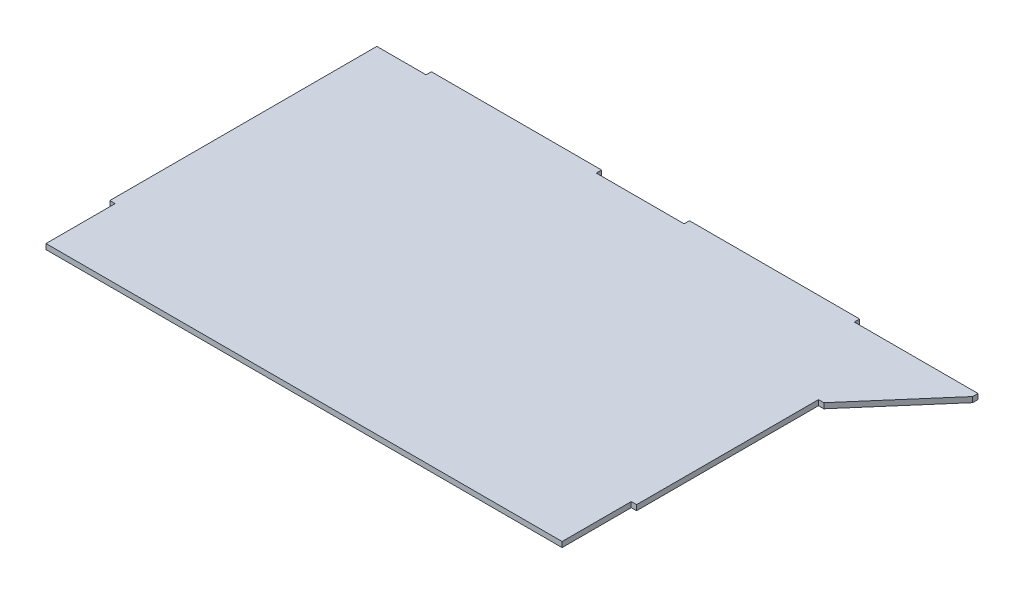
ISO-10303-21;
HEADER;
FILE_DESCRIPTION(('STEP AP214'),'2;1');
FILE_NAME('part.step','',(''),(''),'','','');
FILE_SCHEMA(('AUTOMOTIVE_DESIGN { 1 0 10303 214 1 1 1 1 }'));
ENDSEC;
DATA;
#1=APPLICATION_CONTEXT('core data for automotive mechanical design processes');
#2=APPLICATION_PROTOCOL_DEFINITION('international standard','automotive_design',2000,#1);
#3=PRODUCT_CONTEXT('',#1,'mechanical');
#4=PRODUCT('Part','Part','',(#3));
#5=PRODUCT_RELATED_PRODUCT_CATEGORY('part','',(#4));
#6=PRODUCT_DEFINITION_FORMATION('','',#4);
#7=PRODUCT_DEFINITION_CONTEXT('part definition',#1,'design');
#8=PRODUCT_DEFINITION('design','',#6,#7);
#9=PRODUCT_DEFINITION_SHAPE('','',#8);
#10=(LENGTH_UNIT() NAMED_UNIT(*) SI_UNIT(.MILLI.,.METRE.));
#11=(NAMED_UNIT(*) PLANE_ANGLE_UNIT() SI_UNIT($,.RADIAN.));
#12=(NAMED_UNIT(*) SI_UNIT($,.STERADIAN.) SOLID_ANGLE_UNIT());
#13=UNCERTAINTY_MEASURE_WITH_UNIT(LENGTH_MEASURE(1.E-05),#10,'distance_accuracy_value','');
#14=(GEOMETRIC_REPRESENTATION_CONTEXT(3) GLOBAL_UNCERTAINTY_ASSIGNED_CONTEXT((#13)) GLOBAL_UNIT_ASSIGNED_CONTEXT((#10,
#11,#12)) REPRESENTATION_CONTEXT('',''));
#15=CARTESIAN_POINT('',(0.,0.,0.));
#16=DIRECTION('',(0.,0.,1.));
#17=DIRECTION('',(1.,0.,0.));
#18=AXIS2_PLACEMENT_3D('',#15,#16,#17);
#19=CARTESIAN_POINT('',(0.,0.,0.));
#20=DIRECTION('',(0.,0.,-1.));
#21=DIRECTION('',(-1.,0.,0.));
#22=AXIS2_PLACEMENT_3D('',#19,#20,#21);
#23=PLANE('',#22);
#24=DIRECTION('',(0.,1.,0.));
#25=VECTOR('',#24,1.);
#26=CARTESIAN_POINT('',(-26.2205000100001,1.5875,0.));
#27=LINE('',#26,#25);
#28=CARTESIAN_POINT('',(-26.2205000100001,-1.5875,0.));
#29=VERTEX_POINT('',#28);
#30=CARTESIAN_POINT('',(-26.2205000100001,1.5875,0.));
#31=VERTEX_POINT('',#30);
#32=EDGE_CURVE('E56',#29,#31,#27,.T.);
#33=ORIENTED_EDGE('',*,*,#32,.T.);
#34=DIRECTION('',(-1.,0.,0.));
#35=VECTOR('',#34,1.);
#36=CARTESIAN_POINT('',(-157.21584,1.5875,0.));
#37=LINE('',#36,#35);
#38=CARTESIAN_POINT('',(26.2205000100001,1.5875,0.));
#39=VERTEX_POINT('',#38);
#40=EDGE_CURVE('E300',#39,#31,#37,.T.);
#41=ORIENTED_EDGE('',*,*,#40,.F.);
#42=DIRECTION('',(0.,1.,0.));
#43=VECTOR('',#42,1.);
#44=CARTESIAN_POINT('',(26.2205000100001,1.5875,0.));
#45=LINE('',#44,#43);
#46=CARTESIAN_POINT('',(26.2205000100001,-1.5875,0.));
#47=VERTEX_POINT('',#46);
#48=EDGE_CURVE('E176',#47,#39,#45,.T.);
#49=ORIENTED_EDGE('',*,*,#48,.F.);
#50=DIRECTION('',(1.,0.,0.));
#51=VECTOR('',#50,1.);
#52=CARTESIAN_POINT('',(-157.21584,-1.5875,0.));
#53=LINE('',#52,#51);
#54=EDGE_CURVE('E63',#29,#47,#53,.T.);
#55=ORIENTED_EDGE('',*,*,#54,.F.);
#56=EDGE_LOOP('',(#33,#41,#49,#55));
#57=FACE_BOUND('',#56,.T.);
#58=ADVANCED_FACE('F41',(#57),#23,.T.);
#59=DIRECTION('',(0.,-1.,0.));
#60=VECTOR('',#59,1.);
#61=CARTESIAN_POINT('',(-127.82050001,1.5875,0.));
#62=LINE('',#61,#60);
#63=CARTESIAN_POINT('',(-127.82050001,1.5875,0.));
#64=VERTEX_POINT('',#63);
#65=CARTESIAN_POINT('',(-127.82050001,-1.5875,0.));
#66=VERTEX_POINT('',#65);
#67=EDGE_CURVE('E187',#64,#66,#62,.T.);
#68=ORIENTED_EDGE('',*,*,#67,.T.);
#69=CARTESIAN_POINT('',(-157.21584,-1.5875,0.));
#70=VERTEX_POINT('',#69);
#71=EDGE_CURVE('E292',#70,#66,#53,.T.);
#72=ORIENTED_EDGE('',*,*,#71,.F.);
#73=DIRECTION('',(0.,-1.,0.));
#74=VECTOR('',#73,1.);
#75=CARTESIAN_POINT('',(-157.21584,-1.5875,0.));
#76=LINE('',#75,#74);
#77=CARTESIAN_POINT('',(-157.21584,1.5875,0.));
#78=VERTEX_POINT('',#77);
#79=EDGE_CURVE('E299',#78,#70,#76,.T.);
#80=ORIENTED_EDGE('',*,*,#79,.F.);
#81=EDGE_CURVE('E288',#64,#78,#37,.T.);
#82=ORIENTED_EDGE('',*,*,#81,.F.);
#83=EDGE_LOOP('',(#68,#72,#80,#82));
#84=FACE_BOUND('',#83,.T.);
#85=ADVANCED_FACE('F378',(#84),#23,.T.);
#86=CARTESIAN_POINT('',(157.21584,-1.5875,200.66180012));
#87=DIRECTION('',(-1.,0.,0.));
#88=DIRECTION('',(0.,0.,1.));
#89=AXIS2_PLACEMENT_3D('',#86,#87,#88);
#90=PLANE('',#89);
#91=DIRECTION('',(0.,-1.,0.));
#92=VECTOR('',#91,1.);
#93=CARTESIAN_POINT('',(157.21584,1.5875,50.8));
#94=LINE('',#93,#92);
#95=CARTESIAN_POINT('',(157.21584,1.5875,50.8000000000001));
#96=VERTEX_POINT('',#95);
#97=CARTESIAN_POINT('',(157.21584,-1.5875,50.8));
#98=VERTEX_POINT('',#97);
#99=EDGE_CURVE('E250',#96,#98,#94,.T.);
#100=ORIENTED_EDGE('',*,*,#99,.F.);
#101=DIRECTION('',(0.,0.,-1.));
#102=VECTOR('',#101,1.);
#103=CARTESIAN_POINT('',(157.21584,1.5875,200.66180012));
#104=LINE('',#103,#102);
#105=CARTESIAN_POINT('',(157.21584,1.5875,159.38680012));
#106=VERTEX_POINT('',#105);
#107=EDGE_CURVE('E311',#106,#96,#104,.T.);
#108=ORIENTED_EDGE('',*,*,#107,.F.);
#109=DIRECTION('',(0.,1.,0.));
#110=VECTOR('',#109,1.);
#111=CARTESIAN_POINT('',(157.21584,-1.5875,159.38680012));
#112=LINE('',#111,#110);
#113=CARTESIAN_POINT('',(157.21584,-1.5875,159.38680012));
#114=VERTEX_POINT('',#113);
#115=EDGE_CURVE('E11',#114,#106,#112,.T.);
#116=ORIENTED_EDGE('',*,*,#115,.F.);
#117=DIRECTION('',(0.,0.,-1.));
#118=VECTOR('',#117,1.);
#119=CARTESIAN_POINT('',(157.21584,-1.5875,200.66180012));
#120=LINE('',#119,#118);
#121=EDGE_CURVE('E295',#114,#98,#120,.T.);
#122=ORIENTED_EDGE('',*,*,#121,.T.);
#123=EDGE_LOOP('',(#100,#108,#116,#122));
#124=FACE_BOUND('',#123,.T.);
#125=ADVANCED_FACE('F43',(#124),#90,.F.);
#126=CARTESIAN_POINT('',(-157.21584,1.5875,200.66180012));
#127=DIRECTION('',(0.,-1.,0.));
#128=DIRECTION('',(0.,0.,-1.));
#129=AXIS2_PLACEMENT_3D('',#126,#127,#128);
#130=PLANE('',#129);
#131=DIRECTION('',(-1.,0.,0.));
#132=VECTOR('',#131,1.);
#133=CARTESIAN_POINT('',(-157.21584,1.5875,159.38680012));
#134=LINE('',#133,#132);
#135=CARTESIAN_POINT('',(154.04084,1.5875,159.38680012));
#136=VERTEX_POINT('',#135);
#137=EDGE_CURVE('E268',#106,#136,#134,.T.);
#138=ORIENTED_EDGE('',*,*,#137,.F.);
#139=ORIENTED_EDGE('',*,*,#107,.T.);
#140=DIRECTION('',(-1.,0.,0.));
#141=VECTOR('',#140,1.);
#142=CARTESIAN_POINT('',(157.21584,1.5875,50.8));
#143=LINE('',#142,#141);
#144=CARTESIAN_POINT('',(160.39084,1.5875,50.8));
#145=VERTEX_POINT('',#144);
#146=EDGE_CURVE('E239',#145,#96,#143,.T.);
#147=ORIENTED_EDGE('',*,*,#146,.F.);
#148=DIRECTION('',(-0.654792410139879,0.,0.755808771861778));
#149=VECTOR('',#148,1.);
#150=CARTESIAN_POINT('',(160.39084,1.5875,50.8));
#151=LINE('',#150,#149);
#152=CARTESIAN_POINT('',(201.6506,1.5875,3.175));
#153=VERTEX_POINT('',#152);
#154=EDGE_CURVE('E235',#153,#145,#151,.T.);
#155=ORIENTED_EDGE('',*,*,#154,.F.);
#156=DIRECTION('',(0.,0.,1.));
#157=VECTOR('',#156,1.);
#158=CARTESIAN_POINT('',(201.6506,1.5875,0.));
#159=LINE('',#158,#157);
#160=CARTESIAN_POINT('',(201.6506,1.5875,0.));
#161=VERTEX_POINT('',#160);
#162=EDGE_CURVE('E232',#161,#153,#159,.T.);
#163=ORIENTED_EDGE('',*,*,#162,.F.);
#164=CARTESIAN_POINT('',(127.82050001,1.5875,0.));
#165=VERTEX_POINT('',#164);
#166=EDGE_CURVE('E296',#161,#165,#37,.T.);
#167=ORIENTED_EDGE('',*,*,#166,.T.);
#168=DIRECTION('',(0.,0.,1.));
#169=VECTOR('',#168,1.);
#170=CARTESIAN_POINT('',(127.82050001,1.5875,-3.175));
#171=LINE('',#170,#169);
#172=CARTESIAN_POINT('',(127.82050001,1.5875,-3.175));
#173=VERTEX_POINT('',#172);
#174=EDGE_CURVE('E225',#173,#165,#171,.T.);
#175=ORIENTED_EDGE('',*,*,#174,.F.);
#176=DIRECTION('',(1.,0.,0.));
#177=VECTOR('',#176,1.);
#178=CARTESIAN_POINT('',(127.82050001,1.5875,-3.175));
#179=LINE('',#178,#177);
#180=CARTESIAN_POINT('',(26.2205000100001,1.5875,-3.175));
#181=VERTEX_POINT('',#180);
#182=EDGE_CURVE('E208',#181,#173,#179,.T.);
#183=ORIENTED_EDGE('',*,*,#182,.F.);
#184=DIRECTION('',(0.,0.,1.));
#185=VECTOR('',#184,1.);
#186=CARTESIAN_POINT('',(26.2205000100001,1.5875,-3.175));
#187=LINE('',#186,#185);
#188=EDGE_CURVE('E228',#181,#39,#187,.T.);
#189=ORIENTED_EDGE('',*,*,#188,.T.);
#190=ORIENTED_EDGE('',*,*,#40,.T.);
#191=DIRECTION('',(0.,0.,1.));
#192=VECTOR('',#191,1.);
#193=CARTESIAN_POINT('',(-26.2205000100001,1.5875,-3.175));
#194=LINE('',#193,#192);
#195=CARTESIAN_POINT('',(-26.2205000100001,1.5875,-3.175));
#196=VERTEX_POINT('',#195);
#197=EDGE_CURVE('E197',#196,#31,#194,.T.);
#198=ORIENTED_EDGE('',*,*,#197,.F.);
#199=DIRECTION('',(-1.,0.,0.));
#200=VECTOR('',#199,1.);
#201=CARTESIAN_POINT('',(-127.82050001,1.5875,-3.175));
#202=LINE('',#201,#200);
#203=CARTESIAN_POINT('',(-127.82050001,1.5875,-3.175));
#204=VERTEX_POINT('',#203);
#205=EDGE_CURVE('E186',#196,#204,#202,.T.);
#206=ORIENTED_EDGE('',*,*,#205,.T.);
#207=DIRECTION('',(0.,0.,1.));
#208=VECTOR('',#207,1.);
#209=CARTESIAN_POINT('',(-127.82050001,1.5875,-3.175));
#210=LINE('',#209,#208);
#211=EDGE_CURVE('E202',#204,#64,#210,.T.);
#212=ORIENTED_EDGE('',*,*,#211,.T.);
#213=ORIENTED_EDGE('',*,*,#81,.T.);
#214=DIRECTION('',(0.,0.,-1.));
#215=VECTOR('',#214,1.);
#216=CARTESIAN_POINT('',(-157.21584,1.5875,200.66180012));
#217=LINE('',#216,#215);
#218=CARTESIAN_POINT('',(-157.21584,1.5875,159.38680012));
#219=VERTEX_POINT('',#218);
#220=EDGE_CURVE('E308',#219,#78,#217,.T.);
#221=ORIENTED_EDGE('',*,*,#220,.F.);
#222=DIRECTION('',(1.,0.,0.));
#223=VECTOR('',#222,1.);
#224=CARTESIAN_POINT('',(-157.21584,1.5875,159.38680012));
#225=LINE('',#224,#223);
#226=CARTESIAN_POINT('',(-154.04084,1.5875,159.38680012));
#227=VERTEX_POINT('',#226);
#228=EDGE_CURVE('E285',#219,#227,#225,.T.);
#229=ORIENTED_EDGE('',*,*,#228,.T.);
#230=DIRECTION('',(0.,0.,-1.));
#231=VECTOR('',#230,1.);
#232=CARTESIAN_POINT('',(-154.04084,1.5875,200.66180012));
#233=LINE('',#232,#231);
#234=CARTESIAN_POINT('',(-154.04084,1.5875,200.66180012));
#235=VERTEX_POINT('',#234);
#236=EDGE_CURVE('E283',#235,#227,#233,.T.);
#237=ORIENTED_EDGE('',*,*,#236,.F.);
#238=DIRECTION('',(-1.,0.,0.));
#239=VECTOR('',#238,1.);
#240=CARTESIAN_POINT('',(-157.21584,1.5875,200.66180012));
#241=LINE('',#240,#239);
#242=CARTESIAN_POINT('',(154.04084,1.5875,200.66180012));
#243=VERTEX_POINT('',#242);
#244=EDGE_CURVE('E289',#243,#235,#241,.T.);
#245=ORIENTED_EDGE('',*,*,#244,.F.);
#246=DIRECTION('',(0.,0.,-1.));
#247=VECTOR('',#246,1.);
#248=CARTESIAN_POINT('',(154.04084,1.5875,200.66180012));
#249=LINE('',#248,#247);
#250=EDGE_CURVE('E270',#243,#136,#249,.T.);
#251=ORIENTED_EDGE('',*,*,#250,.T.);
#252=EDGE_LOOP('',(#138,#139,#147,#155,#163,#167,#175,#183,#189,#190,#198,#206,#212,#213,#221,
#229,#237,#245,#251));
#253=FACE_BOUND('',#252,.T.);
#254=ADVANCED_FACE('F324',(#253),#130,.F.);
#255=CARTESIAN_POINT('',(-157.21584,-1.5875,200.66180012));
#256=DIRECTION('',(0.,1.,0.));
#257=DIRECTION('',(0.,0.,1.));
#258=AXIS2_PLACEMENT_3D('',#255,#256,#257);
#259=PLANE('',#258);
#260=DIRECTION('',(-1.,0.,0.));
#261=VECTOR('',#260,1.);
#262=CARTESIAN_POINT('',(0.,-1.5875,159.38680012));
#263=LINE('',#262,#261);
#264=CARTESIAN_POINT('',(154.04084,-1.5875,159.38680012));
#265=VERTEX_POINT('',#264);
#266=EDGE_CURVE('E253',#114,#265,#263,.T.);
#267=ORIENTED_EDGE('',*,*,#266,.T.);
#268=DIRECTION('',(0.,0.,-1.));
#269=VECTOR('',#268,1.);
#270=CARTESIAN_POINT('',(154.04084,-1.5875,0.));
#271=LINE('',#270,#269);
#272=CARTESIAN_POINT('',(154.04084,-1.5875,200.66180012));
#273=VERTEX_POINT('',#272);
#274=EDGE_CURVE('E261',#273,#265,#271,.T.);
#275=ORIENTED_EDGE('',*,*,#274,.F.);
#276=DIRECTION('',(1.,0.,0.));
#277=VECTOR('',#276,1.);
#278=CARTESIAN_POINT('',(-157.21584,-1.5875,200.66180012));
#279=LINE('',#278,#277);
#280=CARTESIAN_POINT('',(-154.04084,-1.5875,200.66180012));
#281=VERTEX_POINT('',#280);
#282=EDGE_CURVE('E291',#281,#273,#279,.T.);
#283=ORIENTED_EDGE('',*,*,#282,.F.);
#284=DIRECTION('',(0.,0.,-1.));
#285=VECTOR('',#284,1.);
#286=CARTESIAN_POINT('',(-154.04084,-1.5875,0.));
#287=LINE('',#286,#285);
#288=CARTESIAN_POINT('',(-154.04084,-1.5875,159.38680012));
#289=VERTEX_POINT('',#288);
#290=EDGE_CURVE('E273',#281,#289,#287,.T.);
#291=ORIENTED_EDGE('',*,*,#290,.T.);
#292=DIRECTION('',(1.,0.,0.));
#293=VECTOR('',#292,1.);
#294=CARTESIAN_POINT('',(0.,-1.5875,159.38680012));
#295=LINE('',#294,#293);
#296=CARTESIAN_POINT('',(-157.21584,-1.5875,159.38680012));
#297=VERTEX_POINT('',#296);
#298=EDGE_CURVE('E276',#297,#289,#295,.T.);
#299=ORIENTED_EDGE('',*,*,#298,.F.);
#300=DIRECTION('',(0.,0.,-1.));
#301=VECTOR('',#300,1.);
#302=CARTESIAN_POINT('',(-157.21584,-1.5875,200.66180012));
#303=LINE('',#302,#301);
#304=EDGE_CURVE('E306',#297,#70,#303,.T.);
#305=ORIENTED_EDGE('',*,*,#304,.T.);
#306=ORIENTED_EDGE('',*,*,#71,.T.);
#307=DIRECTION('',(0.,0.,1.));
#308=VECTOR('',#307,1.);
#309=CARTESIAN_POINT('',(-127.82050001,-1.5875,-3.175));
#310=LINE('',#309,#308);
#311=CARTESIAN_POINT('',(-127.82050001,-1.5875,-3.175));
#312=VERTEX_POINT('',#311);
#313=EDGE_CURVE('E177',#312,#66,#310,.T.);
#314=ORIENTED_EDGE('',*,*,#313,.F.);
#315=DIRECTION('',(1.,0.,0.));
#316=VECTOR('',#315,1.);
#317=CARTESIAN_POINT('',(-127.82050001,-1.5875,-3.175));
#318=LINE('',#317,#316);
#319=CARTESIAN_POINT('',(-26.2205000100001,-1.5875,-3.175));
#320=VERTEX_POINT('',#319);
#321=EDGE_CURVE('E183',#312,#320,#318,.T.);
#322=ORIENTED_EDGE('',*,*,#321,.T.);
#323=DIRECTION('',(0.,0.,1.));
#324=VECTOR('',#323,1.);
#325=CARTESIAN_POINT('',(-26.2205000100001,-1.5875,-3.175));
#326=LINE('',#325,#324);
#327=EDGE_CURVE('E170',#320,#29,#326,.T.);
#328=ORIENTED_EDGE('',*,*,#327,.T.);
#329=ORIENTED_EDGE('',*,*,#54,.T.);
#330=DIRECTION('',(0.,0.,1.));
#331=VECTOR('',#330,1.);
#332=CARTESIAN_POINT('',(26.2205000100001,-1.5875,-3.175));
#333=LINE('',#332,#331);
#334=CARTESIAN_POINT('',(26.2205000100001,-1.5875,-3.175));
#335=VERTEX_POINT('',#334);
#336=EDGE_CURVE('E215',#335,#47,#333,.T.);
#337=ORIENTED_EDGE('',*,*,#336,.F.);
#338=DIRECTION('',(-1.,0.,0.));
#339=VECTOR('',#338,1.);
#340=CARTESIAN_POINT('',(127.82050001,-1.5875,-3.175));
#341=LINE('',#340,#339);
#342=CARTESIAN_POINT('',(127.82050001,-1.5875,-3.175));
#343=VERTEX_POINT('',#342);
#344=EDGE_CURVE('E213',#343,#335,#341,.T.);
#345=ORIENTED_EDGE('',*,*,#344,.F.);
#346=DIRECTION('',(0.,0.,1.));
#347=VECTOR('',#346,1.);
#348=CARTESIAN_POINT('',(127.82050001,-1.5875,-3.175));
#349=LINE('',#348,#347);
#350=CARTESIAN_POINT('',(127.82050001,-1.5875,0.));
#351=VERTEX_POINT('',#350);
#352=EDGE_CURVE('E222',#343,#351,#349,.T.);
#353=ORIENTED_EDGE('',*,*,#352,.T.);
#354=CARTESIAN_POINT('',(201.6506,-1.5875,0.));
#355=VERTEX_POINT('',#354);
#356=EDGE_CURVE('E303',#351,#355,#53,.T.);
#357=ORIENTED_EDGE('',*,*,#356,.T.);
#358=DIRECTION('',(0.,0.,1.));
#359=VECTOR('',#358,1.);
#360=CARTESIAN_POINT('',(201.6506,-1.5875,0.));
#361=LINE('',#360,#359);
#362=CARTESIAN_POINT('',(201.6506,-1.5875,3.175));
#363=VERTEX_POINT('',#362);
#364=EDGE_CURVE('E231',#355,#363,#361,.T.);
#365=ORIENTED_EDGE('',*,*,#364,.T.);
#366=DIRECTION('',(-0.654792410139879,0.,0.755808771861778));
#367=VECTOR('',#366,1.);
#368=CARTESIAN_POINT('',(160.39084,-1.5875,50.8));
#369=LINE('',#368,#367);
#370=CARTESIAN_POINT('',(160.39084,-1.5875,50.8));
#371=VERTEX_POINT('',#370);
#372=EDGE_CURVE('E245',#363,#371,#369,.T.);
#373=ORIENTED_EDGE('',*,*,#372,.T.);
#374=DIRECTION('',(-1.,0.,0.));
#375=VECTOR('',#374,1.);
#376=CARTESIAN_POINT('',(157.21584,-1.5875,50.8));
#377=LINE('',#376,#375);
#378=EDGE_CURVE('E236',#371,#98,#377,.T.);
#379=ORIENTED_EDGE('',*,*,#378,.T.);
#380=ORIENTED_EDGE('',*,*,#121,.F.);
#381=EDGE_LOOP('',(#267,#275,#283,#291,#299,#305,#306,#314,#322,#328,#329,#337,#345,#353,#357,
#365,#373,#379,#380));
#382=FACE_BOUND('',#381,.T.);
#383=ADVANCED_FACE('F190',(#382),#259,.F.);
#384=CARTESIAN_POINT('',(0.,0.,200.66180012));
#385=DIRECTION('',(0.,0.,-1.));
#386=DIRECTION('',(-1.,0.,0.));
#387=AXIS2_PLACEMENT_3D('',#384,#385,#386);
#388=PLANE('',#387);
#389=ORIENTED_EDGE('',*,*,#282,.T.);
#390=DIRECTION('',(0.,-1.,0.));
#391=VECTOR('',#390,1.);
#392=CARTESIAN_POINT('',(154.04084,1.587512,200.66180012));
#393=LINE('',#392,#391);
#394=EDGE_CURVE('E264',#243,#273,#393,.T.);
#395=ORIENTED_EDGE('',*,*,#394,.F.);
#396=ORIENTED_EDGE('',*,*,#244,.T.);
#397=DIRECTION('',(0.,1.,0.));
#398=VECTOR('',#397,1.);
#399=CARTESIAN_POINT('',(-154.04084,0.,200.66180012));
#400=LINE('',#399,#398);
#401=EDGE_CURVE('E49',#281,#235,#400,.T.);
#402=ORIENTED_EDGE('',*,*,#401,.F.);
#403=EDGE_LOOP('',(#389,#395,#396,#402));
#404=FACE_BOUND('',#403,.T.);
#405=ADVANCED_FACE('F337',(#404),#388,.F.);
#406=CARTESIAN_POINT('',(-157.21584,-1.5875,200.66180012));
#407=DIRECTION('',(1.,0.,0.));
#408=DIRECTION('',(0.,0.,-1.));
#409=AXIS2_PLACEMENT_3D('',#406,#407,#408);
#410=PLANE('',#409);
#411=ORIENTED_EDGE('',*,*,#304,.F.);
#412=DIRECTION('',(0.,-1.,0.));
#413=VECTOR('',#412,1.);
#414=CARTESIAN_POINT('',(-157.21584,1.587512,159.38680012));
#415=LINE('',#414,#413);
#416=EDGE_CURVE('E279',#219,#297,#415,.T.);
#417=ORIENTED_EDGE('',*,*,#416,.F.);
#418=ORIENTED_EDGE('',*,*,#220,.T.);
#419=ORIENTED_EDGE('',*,*,#79,.T.);
#420=EDGE_LOOP('',(#411,#417,#418,#419));
#421=FACE_BOUND('',#420,.T.);
#422=ADVANCED_FACE('F332',(#421),#410,.F.);
#423=DIRECTION('',(0.,-1.,0.));
#424=VECTOR('',#423,1.);
#425=CARTESIAN_POINT('',(127.82050001,1.5875,0.));
#426=LINE('',#425,#424);
#427=EDGE_CURVE('E209',#165,#351,#426,.T.);
#428=ORIENTED_EDGE('',*,*,#427,.F.);
#429=ORIENTED_EDGE('',*,*,#166,.F.);
#430=DIRECTION('',(0.,-1.,0.));
#431=VECTOR('',#430,1.);
#432=CARTESIAN_POINT('',(201.6506,1.5875,0.));
#433=LINE('',#432,#431);
#434=EDGE_CURVE('E242',#161,#355,#433,.T.);
#435=ORIENTED_EDGE('',*,*,#434,.T.);
#436=ORIENTED_EDGE('',*,*,#356,.F.);
#437=EDGE_LOOP('',(#428,#429,#435,#436));
#438=FACE_BOUND('',#437,.T.);
#439=ADVANCED_FACE('F360',(#438),#23,.T.);
#440=CARTESIAN_POINT('',(0.,1.587512,159.38680012));
#441=DIRECTION('',(0.,0.,-1.));
#442=DIRECTION('',(-1.,0.,0.));
#443=AXIS2_PLACEMENT_3D('',#440,#441,#442);
#444=PLANE('',#443);
#445=ORIENTED_EDGE('',*,*,#416,.T.);
#446=ORIENTED_EDGE('',*,*,#298,.T.);
#447=DIRECTION('',(0.,-1.,0.));
#448=VECTOR('',#447,1.);
#449=CARTESIAN_POINT('',(-154.04084,1.587512,159.38680012));
#450=LINE('',#449,#448);
#451=EDGE_CURVE('E281',#227,#289,#450,.T.);
#452=ORIENTED_EDGE('',*,*,#451,.F.);
#453=ORIENTED_EDGE('',*,*,#228,.F.);
#454=EDGE_LOOP('',(#445,#446,#452,#453));
#455=FACE_BOUND('',#454,.T.);
#456=ADVANCED_FACE('F328',(#455),#444,.F.);
#457=CARTESIAN_POINT('',(-154.04084,1.587512,0.));
#458=DIRECTION('',(-1.,0.,0.));
#459=DIRECTION('',(0.,0.,1.));
#460=AXIS2_PLACEMENT_3D('',#457,#458,#459);
#461=PLANE('',#460);
#462=ORIENTED_EDGE('',*,*,#236,.T.);
#463=ORIENTED_EDGE('',*,*,#451,.T.);
#464=ORIENTED_EDGE('',*,*,#290,.F.);
#465=ORIENTED_EDGE('',*,*,#401,.T.);
#466=EDGE_LOOP('',(#462,#463,#464,#465));
#467=FACE_BOUND('',#466,.T.);
#468=ADVANCED_FACE('F317',(#467),#461,.T.);
#469=CARTESIAN_POINT('',(154.04084,1.587512,0.));
#470=DIRECTION('',(-1.,0.,0.));
#471=DIRECTION('',(0.,0.,1.));
#472=AXIS2_PLACEMENT_3D('',#469,#470,#471);
#473=PLANE('',#472);
#474=ORIENTED_EDGE('',*,*,#394,.T.);
#475=ORIENTED_EDGE('',*,*,#274,.T.);
#476=DIRECTION('',(0.,-1.,0.));
#477=VECTOR('',#476,1.);
#478=CARTESIAN_POINT('',(154.04084,1.587512,159.38680012));
#479=LINE('',#478,#477);
#480=EDGE_CURVE('E266',#136,#265,#479,.T.);
#481=ORIENTED_EDGE('',*,*,#480,.F.);
#482=ORIENTED_EDGE('',*,*,#250,.F.);
#483=EDGE_LOOP('',(#474,#475,#481,#482));
#484=FACE_BOUND('',#483,.T.);
#485=ADVANCED_FACE('F339',(#484),#473,.F.);
#486=CARTESIAN_POINT('',(0.,1.587512,159.38680012));
#487=DIRECTION('',(0.,0.,1.));
#488=DIRECTION('',(1.,0.,0.));
#489=AXIS2_PLACEMENT_3D('',#486,#487,#488);
#490=PLANE('',#489);
#491=ORIENTED_EDGE('',*,*,#137,.T.);
#492=ORIENTED_EDGE('',*,*,#480,.T.);
#493=ORIENTED_EDGE('',*,*,#266,.F.);
#494=ORIENTED_EDGE('',*,*,#115,.T.);
#495=EDGE_LOOP('',(#491,#492,#493,#494));
#496=FACE_BOUND('',#495,.T.);
#497=ADVANCED_FACE('F423',(#496),#490,.T.);
#498=CARTESIAN_POINT('',(157.21584,1.5875,50.8));
#499=DIRECTION('',(0.,0.,1.));
#500=DIRECTION('',(1.,0.,0.));
#501=AXIS2_PLACEMENT_3D('',#498,#499,#500);
#502=PLANE('',#501);
#503=ORIENTED_EDGE('',*,*,#378,.F.);
#504=DIRECTION('',(0.,-1.,0.));
#505=VECTOR('',#504,1.);
#506=CARTESIAN_POINT('',(160.39084,1.5875,50.8));
#507=LINE('',#506,#505);
#508=EDGE_CURVE('E254',#145,#371,#507,.T.);
#509=ORIENTED_EDGE('',*,*,#508,.F.);
#510=ORIENTED_EDGE('',*,*,#146,.T.);
#511=ORIENTED_EDGE('',*,*,#99,.T.);
#512=EDGE_LOOP('',(#503,#509,#510,#511));
#513=FACE_BOUND('',#512,.T.);
#514=ADVANCED_FACE('F349',(#513),#502,.T.);
#515=CARTESIAN_POINT('',(160.39084,1.5875,50.8));
#516=DIRECTION('',(0.755808771861778,0.,0.654792410139878));
#517=DIRECTION('',(0.654792410139879,0.,-0.755808771861778));
#518=AXIS2_PLACEMENT_3D('',#515,#516,#517);
#519=PLANE('',#518);
#520=ORIENTED_EDGE('',*,*,#372,.F.);
#521=DIRECTION('',(0.,-1.,0.));
#522=VECTOR('',#521,1.);
#523=CARTESIAN_POINT('',(201.6506,1.5875,3.175));
#524=LINE('',#523,#522);
#525=EDGE_CURVE('E256',#153,#363,#524,.T.);
#526=ORIENTED_EDGE('',*,*,#525,.F.);
#527=ORIENTED_EDGE('',*,*,#154,.T.);
#528=ORIENTED_EDGE('',*,*,#508,.T.);
#529=EDGE_LOOP('',(#520,#526,#527,#528));
#530=FACE_BOUND('',#529,.T.);
#531=ADVANCED_FACE('F353',(#530),#519,.T.);
#532=CARTESIAN_POINT('',(201.6506,1.5875,0.));
#533=DIRECTION('',(1.,0.,0.));
#534=DIRECTION('',(0.,0.,-1.));
#535=AXIS2_PLACEMENT_3D('',#532,#533,#534);
#536=PLANE('',#535);
#537=ORIENTED_EDGE('',*,*,#364,.F.);
#538=ORIENTED_EDGE('',*,*,#434,.F.);
#539=ORIENTED_EDGE('',*,*,#162,.T.);
#540=ORIENTED_EDGE('',*,*,#525,.T.);
#541=EDGE_LOOP('',(#537,#538,#539,#540));
#542=FACE_BOUND('',#541,.T.);
#543=ADVANCED_FACE('F358',(#542),#536,.T.);
#544=CARTESIAN_POINT('',(26.2205000100001,1.5875,-3.175));
#545=DIRECTION('',(1.,0.,0.));
#546=DIRECTION('',(0.,0.,-1.));
#547=AXIS2_PLACEMENT_3D('',#544,#545,#546);
#548=PLANE('',#547);
#549=ORIENTED_EDGE('',*,*,#48,.T.);
#550=ORIENTED_EDGE('',*,*,#188,.F.);
#551=DIRECTION('',(0.,1.,0.));
#552=VECTOR('',#551,1.);
#553=CARTESIAN_POINT('',(26.2205000100001,1.5875,-3.175));
#554=LINE('',#553,#552);
#555=EDGE_CURVE('E205',#335,#181,#554,.T.);
#556=ORIENTED_EDGE('',*,*,#555,.F.);
#557=ORIENTED_EDGE('',*,*,#336,.T.);
#558=EDGE_LOOP('',(#549,#550,#556,#557));
#559=FACE_BOUND('',#558,.T.);
#560=ADVANCED_FACE('F373',(#559),#548,.F.);
#561=CARTESIAN_POINT('',(127.82050001,1.5875,-3.175));
#562=DIRECTION('',(-1.,0.,0.));
#563=DIRECTION('',(0.,-1.,0.));
#564=AXIS2_PLACEMENT_3D('',#561,#562,#563);
#565=PLANE('',#564);
#566=ORIENTED_EDGE('',*,*,#427,.T.);
#567=ORIENTED_EDGE('',*,*,#352,.F.);
#568=DIRECTION('',(0.,-1.,0.));
#569=VECTOR('',#568,1.);
#570=CARTESIAN_POINT('',(127.82050001,1.5875,-3.175));
#571=LINE('',#570,#569);
#572=EDGE_CURVE('E211',#173,#343,#571,.T.);
#573=ORIENTED_EDGE('',*,*,#572,.F.);
#574=ORIENTED_EDGE('',*,*,#174,.T.);
#575=EDGE_LOOP('',(#566,#567,#573,#574));
#576=FACE_BOUND('',#575,.T.);
#577=ADVANCED_FACE('F364',(#576),#565,.F.);
#578=CARTESIAN_POINT('',(0.,0.,-3.175));
#579=DIRECTION('',(0.,0.,-1.));
#580=DIRECTION('',(-1.,0.,0.));
#581=AXIS2_PLACEMENT_3D('',#578,#579,#580);
#582=PLANE('',#581);
#583=ORIENTED_EDGE('',*,*,#555,.T.);
#584=ORIENTED_EDGE('',*,*,#182,.T.);
#585=ORIENTED_EDGE('',*,*,#572,.T.);
#586=ORIENTED_EDGE('',*,*,#344,.T.);
#587=EDGE_LOOP('',(#583,#584,#585,#586));
#588=FACE_BOUND('',#587,.T.);
#589=ADVANCED_FACE('F368',(#588),#582,.T.);
#590=CARTESIAN_POINT('',(-26.2205000100001,1.5875,-3.175));
#591=DIRECTION('',(1.,0.,0.));
#592=DIRECTION('',(0.,0.,-1.));
#593=AXIS2_PLACEMENT_3D('',#590,#591,#592);
#594=PLANE('',#593);
#595=ORIENTED_EDGE('',*,*,#32,.F.);
#596=ORIENTED_EDGE('',*,*,#327,.F.);
#597=DIRECTION('',(0.,1.,0.));
#598=VECTOR('',#597,1.);
#599=CARTESIAN_POINT('',(-26.2205000100001,1.5875,-3.175));
#600=LINE('',#599,#598);
#601=EDGE_CURVE('E173',#320,#196,#600,.T.);
#602=ORIENTED_EDGE('',*,*,#601,.T.);
#603=ORIENTED_EDGE('',*,*,#197,.T.);
#604=EDGE_LOOP('',(#595,#596,#602,#603));
#605=FACE_BOUND('',#604,.T.);
#606=ADVANCED_FACE('F172',(#605),#594,.T.);
#607=CARTESIAN_POINT('',(-127.82050001,1.5875,-3.175));
#608=DIRECTION('',(-1.,0.,0.));
#609=DIRECTION('',(0.,-1.,0.));
#610=AXIS2_PLACEMENT_3D('',#607,#608,#609);
#611=PLANE('',#610);
#612=ORIENTED_EDGE('',*,*,#67,.F.);
#613=ORIENTED_EDGE('',*,*,#211,.F.);
#614=DIRECTION('',(0.,-1.,0.));
#615=VECTOR('',#614,1.);
#616=CARTESIAN_POINT('',(-127.82050001,1.5875,-3.175));
#617=LINE('',#616,#615);
#618=EDGE_CURVE('E192',#204,#312,#617,.T.);
#619=ORIENTED_EDGE('',*,*,#618,.T.);
#620=ORIENTED_EDGE('',*,*,#313,.T.);
#621=EDGE_LOOP('',(#612,#613,#619,#620));
#622=FACE_BOUND('',#621,.T.);
#623=ADVANCED_FACE('F380',(#622),#611,.T.);
#624=CARTESIAN_POINT('',(0.,0.,-3.175));
#625=DIRECTION('',(0.,0.,-1.));
#626=DIRECTION('',(1.,0.,0.));
#627=AXIS2_PLACEMENT_3D('',#624,#625,#626);
#628=PLANE('',#627);
#629=ORIENTED_EDGE('',*,*,#601,.F.);
#630=ORIENTED_EDGE('',*,*,#321,.F.);
#631=ORIENTED_EDGE('',*,*,#618,.F.);
#632=ORIENTED_EDGE('',*,*,#205,.F.);
#633=EDGE_LOOP('',(#629,#630,#631,#632));
#634=FACE_BOUND('',#633,.T.);
#635=ADVANCED_FACE('F181',(#634),#628,.T.);
#636=CLOSED_SHELL('',(#58,#85,#125,#254,#383,#405,#422,#439,#456,#468,#485,#497,#514,#531,#543,
#560,#577,#589,#606,#623,#635));
#637=MANIFOLD_SOLID_BREP('B2',#636);
#638=ADVANCED_BREP_SHAPE_REPRESENTATION('',(#18,#637),#14);
#639=SHAPE_DEFINITION_REPRESENTATION(#9,#638);
ENDSEC;
END-ISO-10303-21;
